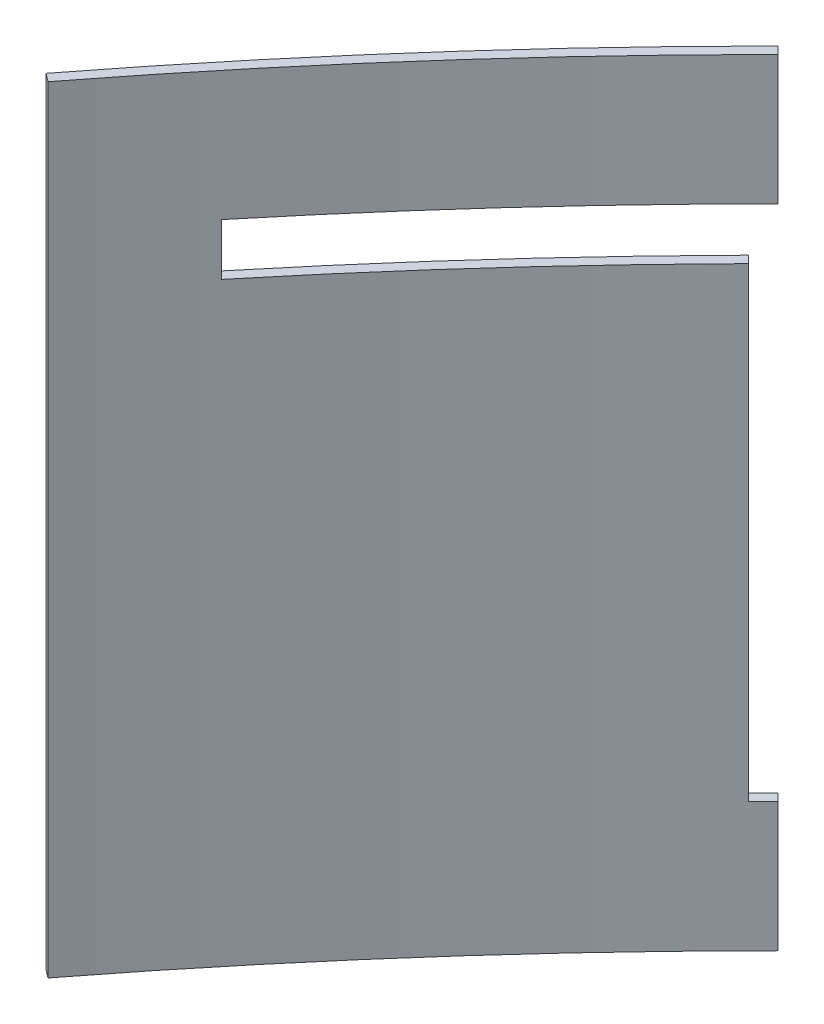
ISO-10303-21;
HEADER;
FILE_DESCRIPTION(('STEP AP214'),'2;1');
FILE_NAME('part.step','',(''),(''),'','','');
FILE_SCHEMA(('AUTOMOTIVE_DESIGN { 1 0 10303 214 1 1 1 1 }'));
ENDSEC;
DATA;
#1=APPLICATION_CONTEXT('core data for automotive mechanical design processes');
#2=APPLICATION_PROTOCOL_DEFINITION('international standard','automotive_design',2000,#1);
#3=PRODUCT_CONTEXT('',#1,'mechanical');
#4=PRODUCT('Part','Part','',(#3));
#5=PRODUCT_RELATED_PRODUCT_CATEGORY('part','',(#4));
#6=PRODUCT_DEFINITION_FORMATION('','',#4);
#7=PRODUCT_DEFINITION_CONTEXT('part definition',#1,'design');
#8=PRODUCT_DEFINITION('design','',#6,#7);
#9=PRODUCT_DEFINITION_SHAPE('','',#8);
#10=(LENGTH_UNIT() NAMED_UNIT(*) SI_UNIT(.MILLI.,.METRE.));
#11=(NAMED_UNIT(*) PLANE_ANGLE_UNIT() SI_UNIT($,.RADIAN.));
#12=(NAMED_UNIT(*) SI_UNIT($,.STERADIAN.) SOLID_ANGLE_UNIT());
#13=UNCERTAINTY_MEASURE_WITH_UNIT(LENGTH_MEASURE(1.E-05),#10,'distance_accuracy_value','');
#14=(GEOMETRIC_REPRESENTATION_CONTEXT(3) GLOBAL_UNCERTAINTY_ASSIGNED_CONTEXT((#13)) GLOBAL_UNIT_ASSIGNED_CONTEXT((#10,
#11,#12)) REPRESENTATION_CONTEXT('',''));
#15=CARTESIAN_POINT('',(0.,0.,0.));
#16=DIRECTION('',(0.,0.,1.));
#17=DIRECTION('',(1.,0.,0.));
#18=AXIS2_PLACEMENT_3D('',#15,#16,#17);
#19=CARTESIAN_POINT('',(-551.755402440362,-5.,-546.083936659809));
#20=DIRECTION('',(0.703444463042392,0.,-0.710750228571895));
#21=DIRECTION('',(0.,-1.,0.));
#22=AXIS2_PLACEMENT_3D('',#19,#20,#21);
#23=PLANE('',#22);
#24=DIRECTION('',(-0.710750228571895,0.,-0.703444463042392));
#25=VECTOR('',#24,1.);
#26=CARTESIAN_POINT('',(-551.755402440362,40.,-546.083936659809));
#27=LINE('',#26,#25);
#28=CARTESIAN_POINT('',(-550.333901983218,40.,-544.677047733724));
#29=VERTEX_POINT('',#28);
#30=CARTESIAN_POINT('',(-551.755402440362,40.,-546.083936659809));
#31=VERTEX_POINT('',#30);
#32=EDGE_CURVE('E11',#29,#31,#27,.T.);
#33=ORIENTED_EDGE('',*,*,#32,.F.);
#34=DIRECTION('',(0.,-1.,0.));
#35=VECTOR('',#34,1.);
#36=CARTESIAN_POINT('',(-550.333901983218,181.409110772813,-544.677047733724));
#37=LINE('',#36,#35);
#38=CARTESIAN_POINT('',(-550.333901983218,-50.,-544.677047733724));
#39=VERTEX_POINT('',#38);
#40=EDGE_CURVE('E90',#29,#39,#37,.T.);
#41=ORIENTED_EDGE('',*,*,#40,.T.);
#42=DIRECTION('',(-0.710750228571895,0.,-0.703444463042392));
#43=VECTOR('',#42,1.);
#44=CARTESIAN_POINT('',(-551.755402440362,-50.,-546.083936659809));
#45=LINE('',#44,#43);
#46=CARTESIAN_POINT('',(-551.755402440362,-50.,-546.083936659809));
#47=VERTEX_POINT('',#46);
#48=EDGE_CURVE('E46',#39,#47,#45,.T.);
#49=ORIENTED_EDGE('',*,*,#48,.T.);
#50=DIRECTION('',(0.,-1.,0.));
#51=VECTOR('',#50,1.);
#52=CARTESIAN_POINT('',(-551.755402440362,40.,-546.083936659809));
#53=LINE('',#52,#51);
#54=EDGE_CURVE('E93',#31,#47,#53,.T.);
#55=ORIENTED_EDGE('',*,*,#54,.F.);
#56=EDGE_LOOP('',(#33,#41,#49,#55));
#57=FACE_BOUND('',#56,.T.);
#58=ADVANCED_FACE('F36',(#57),#23,.T.);
#59=CARTESIAN_POINT('',(0.,-50.,0.));
#60=DIRECTION('',(0.,1.,0.));
#61=DIRECTION('',(0.,0.,1.));
#62=AXIS2_PLACEMENT_3D('',#59,#60,#61);
#63=PLANE('',#62);
#64=ORIENTED_EDGE('',*,*,#48,.F.);
#65=CARTESIAN_POINT('',(0.,-50.,0.));
#66=DIRECTION('',(0.,-1.,0.));
#67=DIRECTION('',(0.,0.,-1.));
#68=AXIS2_PLACEMENT_3D('',#65,#66,#67);
#69=CIRCLE('',#68,774.3);
#70=CARTESIAN_POINT('',(-547.512780672745,-50.,-547.512780672743));
#71=VERTEX_POINT('',#70);
#72=EDGE_CURVE('E106',#39,#71,#69,.T.);
#73=ORIENTED_EDGE('',*,*,#72,.T.);
#74=DIRECTION('',(-0.707106781186549,0.,-0.707106781186546));
#75=VECTOR('',#74,1.);
#76=CARTESIAN_POINT('',(-548.926994235118,-50.,-548.926994235116));
#77=LINE('',#76,#75);
#78=CARTESIAN_POINT('',(-548.926994235118,-50.,-548.926994235116));
#79=VERTEX_POINT('',#78);
#80=EDGE_CURVE('E133',#71,#79,#77,.T.);
#81=ORIENTED_EDGE('',*,*,#80,.T.);
#82=CARTESIAN_POINT('',(0.,-50.,0.));
#83=DIRECTION('',(0.,-1.,0.));
#84=DIRECTION('',(0.,0.,-1.));
#85=AXIS2_PLACEMENT_3D('',#82,#83,#84);
#86=CIRCLE('',#85,776.3);
#87=EDGE_CURVE('E110',#47,#79,#86,.T.);
#88=ORIENTED_EDGE('',*,*,#87,.F.);
#89=EDGE_LOOP('',(#64,#73,#81,#88));
#90=FACE_BOUND('',#89,.T.);
#91=ADVANCED_FACE('F147',(#90),#63,.T.);
#92=CARTESIAN_POINT('',(-548.926994235118,-62.5,-548.926994235116));
#93=DIRECTION('',(0.707106781186546,0.,-0.707106781186549));
#94=DIRECTION('',(0.,-1.,0.));
#95=AXIS2_PLACEMENT_3D('',#92,#93,#94);
#96=PLANE('',#95);
#97=ORIENTED_EDGE('',*,*,#80,.F.);
#98=DIRECTION('',(0.,-1.,0.));
#99=VECTOR('',#98,1.);
#100=CARTESIAN_POINT('',(-547.512780672745,181.409110772813,-547.512780672743));
#101=LINE('',#100,#99);
#102=CARTESIAN_POINT('',(-547.512780672745,-75.,-547.512780672743));
#103=VERTEX_POINT('',#102);
#104=EDGE_CURVE('E184',#71,#103,#101,.T.);
#105=ORIENTED_EDGE('',*,*,#104,.T.);
#106=DIRECTION('',(-0.707106781186549,0.,-0.707106781186546));
#107=VECTOR('',#106,1.);
#108=CARTESIAN_POINT('',(-548.926994235118,-75.,-548.926994235116));
#109=LINE('',#108,#107);
#110=CARTESIAN_POINT('',(-548.926994235118,-75.,-548.926994235116));
#111=VERTEX_POINT('',#110);
#112=EDGE_CURVE('E130',#103,#111,#109,.T.);
#113=ORIENTED_EDGE('',*,*,#112,.T.);
#114=DIRECTION('',(0.,-1.,0.));
#115=VECTOR('',#114,1.);
#116=CARTESIAN_POINT('',(-548.926994235118,-50.,-548.926994235116));
#117=LINE('',#116,#115);
#118=EDGE_CURVE('E148',#79,#111,#117,.T.);
#119=ORIENTED_EDGE('',*,*,#118,.F.);
#120=EDGE_LOOP('',(#97,#105,#113,#119));
#121=FACE_BOUND('',#120,.T.);
#122=ADVANCED_FACE('F187',(#121),#96,.T.);
#123=CARTESIAN_POINT('',(0.,-75.,0.));
#124=DIRECTION('',(0.,-1.,0.));
#125=DIRECTION('',(0.,0.,-1.));
#126=AXIS2_PLACEMENT_3D('',#123,#124,#125);
#127=PLANE('',#126);
#128=ORIENTED_EDGE('',*,*,#112,.F.);
#129=CARTESIAN_POINT('',(0.,-75.,0.));
#130=DIRECTION('',(0.,-1.,0.));
#131=DIRECTION('',(0.,0.,-1.));
#132=AXIS2_PLACEMENT_3D('',#129,#130,#131);
#133=CIRCLE('',#132,774.3);
#134=CARTESIAN_POINT('',(-613.479676413379,-75.,-472.422667351743));
#135=VERTEX_POINT('',#134);
#136=EDGE_CURVE('E181',#103,#135,#133,.F.);
#137=ORIENTED_EDGE('',*,*,#136,.T.);
#138=DIRECTION('',(-0.792302307133383,0.,-0.610128719297099));
#139=VECTOR('',#138,1.);
#140=CARTESIAN_POINT('',(-615.064281027645,-75.,-473.642924790338));
#141=LINE('',#140,#139);
#142=CARTESIAN_POINT('',(-615.064281027645,-75.,-473.642924790338));
#143=VERTEX_POINT('',#142);
#144=EDGE_CURVE('E127',#135,#143,#141,.T.);
#145=ORIENTED_EDGE('',*,*,#144,.T.);
#146=CARTESIAN_POINT('',(0.,-75.,0.));
#147=DIRECTION('',(0.,1.,0.));
#148=DIRECTION('',(0.,0.,1.));
#149=AXIS2_PLACEMENT_3D('',#146,#147,#148);
#150=CIRCLE('',#149,776.3);
#151=EDGE_CURVE('E150',#111,#143,#150,.T.);
#152=ORIENTED_EDGE('',*,*,#151,.F.);
#153=EDGE_LOOP('',(#128,#137,#145,#152));
#154=FACE_BOUND('',#153,.T.);
#155=ADVANCED_FACE('F193',(#154),#127,.T.);
#156=CARTESIAN_POINT('',(-615.064281027646,0.,-473.642924790337));
#157=DIRECTION('',(-0.610128719297098,0.,0.792302307133384));
#158=DIRECTION('',(0.,1.,0.));
#159=AXIS2_PLACEMENT_3D('',#156,#157,#158);
#160=PLANE('',#159);
#161=ORIENTED_EDGE('',*,*,#144,.F.);
#162=DIRECTION('',(0.,-1.,0.));
#163=VECTOR('',#162,1.);
#164=CARTESIAN_POINT('',(-613.479676413379,181.409110772813,-472.422667351743));
#165=LINE('',#164,#163);
#166=CARTESIAN_POINT('',(-613.479676413379,75.,-472.422667351743));
#167=VERTEX_POINT('',#166);
#168=EDGE_CURVE('E178',#135,#167,#165,.F.);
#169=ORIENTED_EDGE('',*,*,#168,.T.);
#170=DIRECTION('',(-0.792302307133384,0.,-0.610128719297098));
#171=VECTOR('',#170,1.);
#172=CARTESIAN_POINT('',(-615.064281027646,75.,-473.642924790337));
#173=LINE('',#172,#171);
#174=CARTESIAN_POINT('',(-615.064281027646,75.,-473.642924790337));
#175=VERTEX_POINT('',#174);
#176=EDGE_CURVE('E124',#167,#175,#173,.T.);
#177=ORIENTED_EDGE('',*,*,#176,.T.);
#178=DIRECTION('',(0.,1.,0.));
#179=VECTOR('',#178,1.);
#180=CARTESIAN_POINT('',(-615.064281027646,-75.,-473.642924790337));
#181=LINE('',#180,#179);
#182=EDGE_CURVE('E155',#143,#175,#181,.T.);
#183=ORIENTED_EDGE('',*,*,#182,.F.);
#184=EDGE_LOOP('',(#161,#169,#177,#183));
#185=FACE_BOUND('',#184,.T.);
#186=ADVANCED_FACE('F202',(#185),#160,.T.);
#187=CARTESIAN_POINT('',(0.,75.,0.));
#188=DIRECTION('',(0.,1.,0.));
#189=DIRECTION('',(0.,0.,1.));
#190=AXIS2_PLACEMENT_3D('',#187,#188,#189);
#191=PLANE('',#190);
#192=ORIENTED_EDGE('',*,*,#176,.F.);
#193=CARTESIAN_POINT('',(0.,75.,0.));
#194=DIRECTION('',(0.,-1.,0.));
#195=DIRECTION('',(0.,0.,-1.));
#196=AXIS2_PLACEMENT_3D('',#193,#194,#195);
#197=CIRCLE('',#196,774.3);
#198=CARTESIAN_POINT('',(-547.512780672745,75.,-547.512780672743));
#199=VERTEX_POINT('',#198);
#200=EDGE_CURVE('E175',#167,#199,#197,.T.);
#201=ORIENTED_EDGE('',*,*,#200,.T.);
#202=DIRECTION('',(-0.707106781186549,0.,-0.707106781186546));
#203=VECTOR('',#202,1.);
#204=CARTESIAN_POINT('',(-548.926994235118,75.,-548.926994235116));
#205=LINE('',#204,#203);
#206=CARTESIAN_POINT('',(-548.926994235118,75.,-548.926994235116));
#207=VERTEX_POINT('',#206);
#208=EDGE_CURVE('E121',#199,#207,#205,.T.);
#209=ORIENTED_EDGE('',*,*,#208,.T.);
#210=CARTESIAN_POINT('',(0.,75.,0.));
#211=DIRECTION('',(0.,-1.,0.));
#212=DIRECTION('',(0.,0.,-1.));
#213=AXIS2_PLACEMENT_3D('',#210,#211,#212);
#214=CIRCLE('',#213,776.3);
#215=EDGE_CURVE('E158',#175,#207,#214,.T.);
#216=ORIENTED_EDGE('',*,*,#215,.F.);
#217=EDGE_LOOP('',(#192,#201,#209,#216));
#218=FACE_BOUND('',#217,.T.);
#219=ADVANCED_FACE('F206',(#218),#191,.T.);
#220=CARTESIAN_POINT('',(-548.926994235118,62.5,-548.926994235116));
#221=DIRECTION('',(0.707106781186546,0.,-0.707106781186549));
#222=DIRECTION('',(0.,-1.,0.));
#223=AXIS2_PLACEMENT_3D('',#220,#221,#222);
#224=PLANE('',#223);
#225=ORIENTED_EDGE('',*,*,#208,.F.);
#226=DIRECTION('',(0.,-1.,0.));
#227=VECTOR('',#226,1.);
#228=CARTESIAN_POINT('',(-547.512780672745,181.409110772813,-547.512780672743));
#229=LINE('',#228,#227);
#230=CARTESIAN_POINT('',(-547.512780672745,50.,-547.512780672743));
#231=VERTEX_POINT('',#230);
#232=EDGE_CURVE('E172',#199,#231,#229,.T.);
#233=ORIENTED_EDGE('',*,*,#232,.T.);
#234=DIRECTION('',(-0.707106781186549,0.,-0.707106781186546));
#235=VECTOR('',#234,1.);
#236=CARTESIAN_POINT('',(-548.926994235118,50.,-548.926994235116));
#237=LINE('',#236,#235);
#238=CARTESIAN_POINT('',(-548.926994235118,50.,-548.926994235116));
#239=VERTEX_POINT('',#238);
#240=EDGE_CURVE('E118',#231,#239,#237,.T.);
#241=ORIENTED_EDGE('',*,*,#240,.T.);
#242=DIRECTION('',(0.,-1.,0.));
#243=VECTOR('',#242,1.);
#244=CARTESIAN_POINT('',(-548.926994235118,75.,-548.926994235116));
#245=LINE('',#244,#243);
#246=EDGE_CURVE('E161',#207,#239,#245,.T.);
#247=ORIENTED_EDGE('',*,*,#246,.F.);
#248=EDGE_LOOP('',(#225,#233,#241,#247));
#249=FACE_BOUND('',#248,.T.);
#250=ADVANCED_FACE('F210',(#249),#224,.T.);
#251=CARTESIAN_POINT('',(0.,50.,0.));
#252=DIRECTION('',(0.,-1.,0.));
#253=DIRECTION('',(0.,0.,-1.));
#254=AXIS2_PLACEMENT_3D('',#251,#252,#253);
#255=PLANE('',#254);
#256=ORIENTED_EDGE('',*,*,#240,.F.);
#257=CARTESIAN_POINT('',(0.,50.,0.));
#258=DIRECTION('',(0.,-1.,0.));
#259=DIRECTION('',(0.,0.,-1.));
#260=AXIS2_PLACEMENT_3D('',#257,#258,#259);
#261=CIRCLE('',#260,774.3);
#262=CARTESIAN_POINT('',(-598.609131740168,50.,-491.128900999811));
#263=VERTEX_POINT('',#262);
#264=EDGE_CURVE('E112',#231,#263,#261,.F.);
#265=ORIENTED_EDGE('',*,*,#264,.T.);
#266=DIRECTION('',(-0.773097160971416,0.,-0.634287615910902));
#267=VECTOR('',#266,1.);
#268=CARTESIAN_POINT('',(-600.15532606211,50.,-492.397476231633));
#269=LINE('',#268,#267);
#270=CARTESIAN_POINT('',(-600.15532606211,50.,-492.397476231633));
#271=VERTEX_POINT('',#270);
#272=EDGE_CURVE('E116',#263,#271,#269,.T.);
#273=ORIENTED_EDGE('',*,*,#272,.T.);
#274=CARTESIAN_POINT('',(0.,50.,0.));
#275=DIRECTION('',(0.,1.,0.));
#276=DIRECTION('',(0.,0.,1.));
#277=AXIS2_PLACEMENT_3D('',#274,#275,#276);
#278=CIRCLE('',#277,776.3);
#279=EDGE_CURVE('E164',#239,#271,#278,.T.);
#280=ORIENTED_EDGE('',*,*,#279,.F.);
#281=EDGE_LOOP('',(#256,#265,#273,#280));
#282=FACE_BOUND('',#281,.T.);
#283=ADVANCED_FACE('F215',(#282),#255,.T.);
#284=CARTESIAN_POINT('',(-600.155326062111,45.,-492.397476231633));
#285=DIRECTION('',(0.634287615910901,0.,-0.773097160971417));
#286=DIRECTION('',(0.,-1.,0.));
#287=AXIS2_PLACEMENT_3D('',#284,#285,#286);
#288=PLANE('',#287);
#289=ORIENTED_EDGE('',*,*,#272,.F.);
#290=DIRECTION('',(0.,-1.,0.));
#291=VECTOR('',#290,1.);
#292=CARTESIAN_POINT('',(-598.609131740168,181.409110772813,-491.128900999811));
#293=LINE('',#292,#291);
#294=CARTESIAN_POINT('',(-598.609131740168,40.,-491.128900999811));
#295=VERTEX_POINT('',#294);
#296=EDGE_CURVE('E108',#263,#295,#293,.T.);
#297=ORIENTED_EDGE('',*,*,#296,.T.);
#298=DIRECTION('',(-0.773097160971417,0.,-0.634287615910901));
#299=VECTOR('',#298,1.);
#300=CARTESIAN_POINT('',(-600.155326062111,40.,-492.397476231633));
#301=LINE('',#300,#299);
#302=CARTESIAN_POINT('',(-600.155326062111,40.,-492.397476231633));
#303=VERTEX_POINT('',#302);
#304=EDGE_CURVE('E40',#295,#303,#301,.T.);
#305=ORIENTED_EDGE('',*,*,#304,.T.);
#306=DIRECTION('',(0.,-1.,0.));
#307=VECTOR('',#306,1.);
#308=CARTESIAN_POINT('',(-600.155326062111,50.,-492.397476231633));
#309=LINE('',#308,#307);
#310=EDGE_CURVE('E167',#271,#303,#309,.T.);
#311=ORIENTED_EDGE('',*,*,#310,.F.);
#312=EDGE_LOOP('',(#289,#297,#305,#311));
#313=FACE_BOUND('',#312,.T.);
#314=ADVANCED_FACE('F216',(#313),#288,.T.);
#315=CARTESIAN_POINT('',(0.,40.,0.));
#316=DIRECTION('',(0.,1.,0.));
#317=DIRECTION('',(0.,0.,1.));
#318=AXIS2_PLACEMENT_3D('',#315,#316,#317);
#319=PLANE('',#318);
#320=CARTESIAN_POINT('',(0.,40.,0.));
#321=DIRECTION('',(0.,-1.,0.));
#322=DIRECTION('',(0.,0.,-1.));
#323=AXIS2_PLACEMENT_3D('',#320,#321,#322);
#324=CIRCLE('',#323,774.3);
#325=EDGE_CURVE('E103',#295,#29,#324,.T.);
#326=ORIENTED_EDGE('',*,*,#325,.T.);
#327=ORIENTED_EDGE('',*,*,#32,.T.);
#328=CARTESIAN_POINT('',(0.,40.,0.));
#329=DIRECTION('',(0.,-1.,0.));
#330=DIRECTION('',(0.,0.,-1.));
#331=AXIS2_PLACEMENT_3D('',#328,#329,#330);
#332=CIRCLE('',#331,776.3);
#333=EDGE_CURVE('E146',#303,#31,#332,.T.);
#334=ORIENTED_EDGE('',*,*,#333,.F.);
#335=ORIENTED_EDGE('',*,*,#304,.F.);
#336=EDGE_LOOP('',(#326,#327,#334,#335));
#337=FACE_BOUND('',#336,.T.);
#338=ADVANCED_FACE('F38',(#337),#319,.T.);
#339=CARTESIAN_POINT('',(0.,181.409110772813,0.));
#340=DIRECTION('',(0.,-1.,0.));
#341=DIRECTION('',(0.,0.,-1.));
#342=AXIS2_PLACEMENT_3D('',#339,#340,#341);
#343=CYLINDRICAL_SURFACE('',#342,776.3);
#344=ORIENTED_EDGE('',*,*,#310,.T.);
#345=ORIENTED_EDGE('',*,*,#333,.T.);
#346=ORIENTED_EDGE('',*,*,#54,.T.);
#347=ORIENTED_EDGE('',*,*,#87,.T.);
#348=ORIENTED_EDGE('',*,*,#118,.T.);
#349=ORIENTED_EDGE('',*,*,#151,.T.);
#350=ORIENTED_EDGE('',*,*,#182,.T.);
#351=ORIENTED_EDGE('',*,*,#215,.T.);
#352=ORIENTED_EDGE('',*,*,#246,.T.);
#353=ORIENTED_EDGE('',*,*,#279,.T.);
#354=EDGE_LOOP('',(#344,#345,#346,#347,#348,#349,#350,#351,#352,#353));
#355=FACE_BOUND('',#354,.T.);
#356=ADVANCED_FACE('F143',(#355),#343,.T.);
#357=CARTESIAN_POINT('',(0.,181.409110772813,0.));
#358=DIRECTION('',(0.,-1.,0.));
#359=DIRECTION('',(0.,0.,-1.));
#360=AXIS2_PLACEMENT_3D('',#357,#358,#359);
#361=CYLINDRICAL_SURFACE('',#360,774.3);
#362=ORIENTED_EDGE('',*,*,#296,.F.);
#363=ORIENTED_EDGE('',*,*,#264,.F.);
#364=ORIENTED_EDGE('',*,*,#232,.F.);
#365=ORIENTED_EDGE('',*,*,#200,.F.);
#366=ORIENTED_EDGE('',*,*,#168,.F.);
#367=ORIENTED_EDGE('',*,*,#136,.F.);
#368=ORIENTED_EDGE('',*,*,#104,.F.);
#369=ORIENTED_EDGE('',*,*,#72,.F.);
#370=ORIENTED_EDGE('',*,*,#40,.F.);
#371=ORIENTED_EDGE('',*,*,#325,.F.);
#372=EDGE_LOOP('',(#362,#363,#364,#365,#366,#367,#368,#369,#370,#371));
#373=FACE_BOUND('',#372,.T.);
#374=ADVANCED_FACE('F102',(#373),#361,.F.);
#375=CLOSED_SHELL('',(#58,#91,#122,#155,#186,#219,#250,#283,#314,#338,#356,#374));
#376=MANIFOLD_SOLID_BREP('B2',#375);
#377=ADVANCED_BREP_SHAPE_REPRESENTATION('',(#18,#376),#14);
#378=SHAPE_DEFINITION_REPRESENTATION(#9,#377);
ENDSEC;
END-ISO-10303-21;
